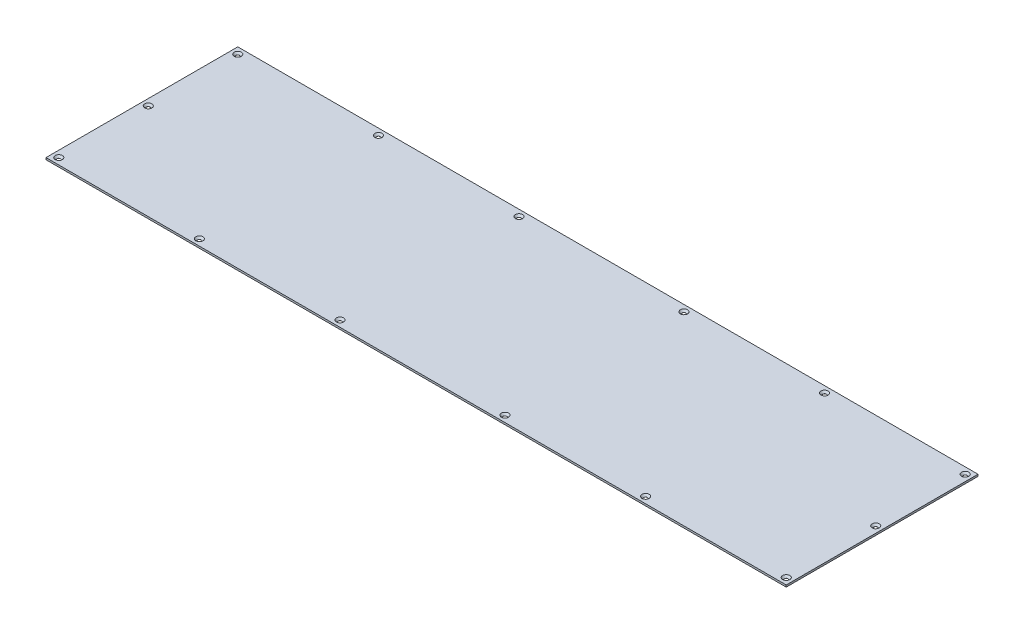
ISO-10303-21;
HEADER;
FILE_DESCRIPTION(('STEP AP214'),'2;1');
FILE_NAME('part.step','',(''),(''),'','','');
FILE_SCHEMA(('AUTOMOTIVE_DESIGN { 1 0 10303 214 1 1 1 1 }'));
ENDSEC;
DATA;
#1=APPLICATION_CONTEXT('core data for automotive mechanical design processes');
#2=APPLICATION_PROTOCOL_DEFINITION('international standard','automotive_design',2000,#1);
#3=PRODUCT_CONTEXT('',#1,'mechanical');
#4=PRODUCT('Part','Part','',(#3));
#5=PRODUCT_RELATED_PRODUCT_CATEGORY('part','',(#4));
#6=PRODUCT_DEFINITION_FORMATION('','',#4);
#7=PRODUCT_DEFINITION_CONTEXT('part definition',#1,'design');
#8=PRODUCT_DEFINITION('design','',#6,#7);
#9=PRODUCT_DEFINITION_SHAPE('','',#8);
#10=(LENGTH_UNIT() NAMED_UNIT(*) SI_UNIT(.MILLI.,.METRE.));
#11=(NAMED_UNIT(*) PLANE_ANGLE_UNIT() SI_UNIT($,.RADIAN.));
#12=(NAMED_UNIT(*) SI_UNIT($,.STERADIAN.) SOLID_ANGLE_UNIT());
#13=UNCERTAINTY_MEASURE_WITH_UNIT(LENGTH_MEASURE(1.E-05),#10,'distance_accuracy_value','');
#14=(GEOMETRIC_REPRESENTATION_CONTEXT(3) GLOBAL_UNCERTAINTY_ASSIGNED_CONTEXT((#13)) GLOBAL_UNIT_ASSIGNED_CONTEXT((#10,
#11,#12)) REPRESENTATION_CONTEXT('',''));
#15=CARTESIAN_POINT('',(0.,0.,0.));
#16=DIRECTION('',(0.,0.,1.));
#17=DIRECTION('',(1.,0.,0.));
#18=AXIS2_PLACEMENT_3D('',#15,#16,#17);
#19=CARTESIAN_POINT('',(578.999999999998,3.00000000000056,150.000000000002));
#20=DIRECTION('',(-1.,0.,0.));
#21=DIRECTION('',(0.,0.,1.00000000000001));
#22=AXIS2_PLACEMENT_3D('',#19,#20,#21);
#23=PLANE('',#22);
#24=DIRECTION('',(0.,0.,-1.00000000000001));
#25=VECTOR('',#24,1.);
#26=CARTESIAN_POINT('',(578.999999999998,5.55111512312578E-13,150.000000000002));
#27=LINE('',#26,#25);
#28=CARTESIAN_POINT('',(578.999999999998,5.55111512312578E-13,150.000000000002));
#29=VERTEX_POINT('',#28);
#30=CARTESIAN_POINT('',(579.000000000001,0.,-150.000000000002));
#31=VERTEX_POINT('',#30);
#32=EDGE_CURVE('E97',#29,#31,#27,.T.);
#33=ORIENTED_EDGE('',*,*,#32,.T.);
#34=DIRECTION('',(0.,-1.00000000000001,0.));
#35=VECTOR('',#34,1.);
#36=CARTESIAN_POINT('',(579.000000000001,3.,-150.000000000002));
#37=LINE('',#36,#35);
#38=CARTESIAN_POINT('',(579.000000000001,3.,-150.000000000002));
#39=VERTEX_POINT('',#38);
#40=EDGE_CURVE('E11',#39,#31,#37,.T.);
#41=ORIENTED_EDGE('',*,*,#40,.F.);
#42=DIRECTION('',(0.,0.,-1.00000000000001));
#43=VECTOR('',#42,1.);
#44=CARTESIAN_POINT('',(578.999999999998,3.00000000000056,150.000000000002));
#45=LINE('',#44,#43);
#46=CARTESIAN_POINT('',(578.999999999998,3.00000000000056,150.000000000002));
#47=VERTEX_POINT('',#46);
#48=EDGE_CURVE('E85',#47,#39,#45,.T.);
#49=ORIENTED_EDGE('',*,*,#48,.F.);
#50=DIRECTION('',(0.,-1.00000000000001,0.));
#51=VECTOR('',#50,1.);
#52=CARTESIAN_POINT('',(578.999999999998,3.00000000000056,150.000000000002));
#53=LINE('',#52,#51);
#54=EDGE_CURVE('E93',#47,#29,#53,.T.);
#55=ORIENTED_EDGE('',*,*,#54,.T.);
#56=EDGE_LOOP('',(#33,#41,#49,#55));
#57=FACE_BOUND('',#56,.T.);
#58=ADVANCED_FACE('F34',(#57),#23,.F.);
#59=CARTESIAN_POINT('',(-578.999999999999,3.,-150.000000000002));
#60=DIRECTION('',(0.,0.,1.00000000000001));
#61=DIRECTION('',(1.,0.,0.));
#62=AXIS2_PLACEMENT_3D('',#59,#60,#61);
#63=PLANE('',#62);
#64=DIRECTION('',(-1.,0.,0.));
#65=VECTOR('',#64,1.);
#66=CARTESIAN_POINT('',(-578.999999999999,0.,-150.000000000002));
#67=LINE('',#66,#65);
#68=CARTESIAN_POINT('',(-578.999999999999,0.,-150.000000000002));
#69=VERTEX_POINT('',#68);
#70=EDGE_CURVE('E89',#31,#69,#67,.T.);
#71=ORIENTED_EDGE('',*,*,#70,.T.);
#72=DIRECTION('',(0.,-1.00000000000001,0.));
#73=VECTOR('',#72,1.);
#74=CARTESIAN_POINT('',(-578.999999999999,3.,-150.000000000002));
#75=LINE('',#74,#73);
#76=CARTESIAN_POINT('',(-578.999999999999,3.,-150.000000000002));
#77=VERTEX_POINT('',#76);
#78=EDGE_CURVE('E42',#77,#69,#75,.T.);
#79=ORIENTED_EDGE('',*,*,#78,.F.);
#80=DIRECTION('',(-1.,0.,0.));
#81=VECTOR('',#80,1.);
#82=CARTESIAN_POINT('',(-578.999999999999,3.,-150.000000000002));
#83=LINE('',#82,#81);
#84=EDGE_CURVE('E80',#39,#77,#83,.T.);
#85=ORIENTED_EDGE('',*,*,#84,.F.);
#86=ORIENTED_EDGE('',*,*,#40,.T.);
#87=EDGE_LOOP('',(#71,#79,#85,#86));
#88=FACE_BOUND('',#87,.T.);
#89=ADVANCED_FACE('F88',(#88),#63,.F.);
#90=CARTESIAN_POINT('',(-579.000000000002,3.00000000000056,150.000000000001));
#91=DIRECTION('',(1.,0.,0.));
#92=DIRECTION('',(0.,0.,-1.00000000000001));
#93=AXIS2_PLACEMENT_3D('',#90,#91,#92);
#94=PLANE('',#93);
#95=DIRECTION('',(0.,0.,1.00000000000001));
#96=VECTOR('',#95,1.);
#97=CARTESIAN_POINT('',(-579.000000000002,5.55111512312578E-13,150.000000000001));
#98=LINE('',#97,#96);
#99=CARTESIAN_POINT('',(-579.000000000002,5.55111512312578E-13,150.000000000001));
#100=VERTEX_POINT('',#99);
#101=EDGE_CURVE('E67',#69,#100,#98,.T.);
#102=ORIENTED_EDGE('',*,*,#101,.T.);
#103=DIRECTION('',(0.,-1.00000000000001,0.));
#104=VECTOR('',#103,1.);
#105=CARTESIAN_POINT('',(-579.000000000002,3.00000000000056,150.000000000001));
#106=LINE('',#105,#104);
#107=CARTESIAN_POINT('',(-579.000000000002,3.00000000000056,150.000000000001));
#108=VERTEX_POINT('',#107);
#109=EDGE_CURVE('E90',#108,#100,#106,.T.);
#110=ORIENTED_EDGE('',*,*,#109,.F.);
#111=DIRECTION('',(0.,0.,1.00000000000001));
#112=VECTOR('',#111,1.);
#113=CARTESIAN_POINT('',(-579.000000000002,3.00000000000056,150.000000000001));
#114=LINE('',#113,#112);
#115=EDGE_CURVE('E83',#77,#108,#114,.T.);
#116=ORIENTED_EDGE('',*,*,#115,.F.);
#117=ORIENTED_EDGE('',*,*,#78,.T.);
#118=EDGE_LOOP('',(#102,#110,#116,#117));
#119=FACE_BOUND('',#118,.T.);
#120=ADVANCED_FACE('F91',(#119),#94,.F.);
#121=CARTESIAN_POINT('',(-579.000000000002,3.00000000000056,150.000000000001));
#122=DIRECTION('',(0.,0.,-1.00000000000001));
#123=DIRECTION('',(-1.,0.,0.));
#124=AXIS2_PLACEMENT_3D('',#121,#122,#123);
#125=PLANE('',#124);
#126=DIRECTION('',(1.,0.,0.));
#127=VECTOR('',#126,1.);
#128=CARTESIAN_POINT('',(-579.000000000002,5.55111512312578E-13,150.000000000001));
#129=LINE('',#128,#127);
#130=EDGE_CURVE('E73',#100,#29,#129,.T.);
#131=ORIENTED_EDGE('',*,*,#130,.T.);
#132=ORIENTED_EDGE('',*,*,#54,.F.);
#133=DIRECTION('',(1.,0.,0.));
#134=VECTOR('',#133,1.);
#135=CARTESIAN_POINT('',(-579.000000000002,3.00000000000056,150.000000000001));
#136=LINE('',#135,#134);
#137=EDGE_CURVE('E50',#108,#47,#136,.T.);
#138=ORIENTED_EDGE('',*,*,#137,.F.);
#139=ORIENTED_EDGE('',*,*,#109,.T.);
#140=EDGE_LOOP('',(#131,#132,#138,#139));
#141=FACE_BOUND('',#140,.T.);
#142=ADVANCED_FACE('F105',(#141),#125,.F.);
#143=CARTESIAN_POINT('',(0.,3.,1.11022302462516E-13));
#144=DIRECTION('',(0.,-1.00000000000001,0.));
#145=DIRECTION('',(0.,0.,-1.00000000000001));
#146=AXIS2_PLACEMENT_3D('',#143,#144,#145);
#147=PLANE('',#146);
#148=CARTESIAN_POINT('',(-569.,2.99999999999984,140.000000000002));
#149=DIRECTION('',(0.,1.00000000000001,0.));
#150=DIRECTION('',(0.,0.,1.00000000000001));
#151=AXIS2_PLACEMENT_3D('',#148,#149,#150);
#152=CIRCLE('',#151,5.60000000000005);
#153=CARTESIAN_POINT('',(-569.,2.99999999999984,145.600000000002));
#154=VERTEX_POINT('',#153);
#155=EDGE_CURVE('E233',#154,#154,#152,.T.);
#156=ORIENTED_EDGE('',*,*,#155,.F.);
#157=EDGE_LOOP('',(#156));
#158=FACE_BOUND('',#157,.T.);
#159=CARTESIAN_POINT('',(-568.999999999999,3.,1.11022302462516E-13));
#160=DIRECTION('',(0.,1.00000000000001,0.));
#161=DIRECTION('',(0.,0.,1.00000000000001));
#162=AXIS2_PLACEMENT_3D('',#159,#160,#161);
#163=CIRCLE('',#162,5.60000000000005);
#164=CARTESIAN_POINT('',(-568.999999999999,3.,5.60000000000024));
#165=VERTEX_POINT('',#164);
#166=EDGE_CURVE('E224',#165,#165,#163,.T.);
#167=ORIENTED_EDGE('',*,*,#166,.F.);
#168=EDGE_LOOP('',(#167));
#169=FACE_BOUND('',#168,.T.);
#170=CARTESIAN_POINT('',(-569.000000000001,3.00000000000003,-140.000000000002));
#171=DIRECTION('',(0.,1.00000000000001,0.));
#172=DIRECTION('',(0.,0.,1.00000000000001));
#173=AXIS2_PLACEMENT_3D('',#170,#171,#172);
#174=CIRCLE('',#173,5.60000000000005);
#175=CARTESIAN_POINT('',(-569.000000000001,3.00000000000003,-134.400000000002));
#176=VERTEX_POINT('',#175);
#177=EDGE_CURVE('E215',#176,#176,#174,.T.);
#178=ORIENTED_EDGE('',*,*,#177,.F.);
#179=EDGE_LOOP('',(#178));
#180=FACE_BOUND('',#179,.T.);
#181=CARTESIAN_POINT('',(-348.999999999999,3.00000000000089,-140.000000000002));
#182=DIRECTION('',(0.,1.00000000000001,0.));
#183=DIRECTION('',(0.,0.,1.00000000000001));
#184=AXIS2_PLACEMENT_3D('',#181,#182,#183);
#185=CIRCLE('',#184,5.59999999999999);
#186=CARTESIAN_POINT('',(-348.999999999999,3.00000000000089,-134.400000000002));
#187=VERTEX_POINT('',#186);
#188=EDGE_CURVE('E206',#187,#187,#185,.T.);
#189=ORIENTED_EDGE('',*,*,#188,.F.);
#190=EDGE_LOOP('',(#189));
#191=FACE_BOUND('',#190,.T.);
#192=CARTESIAN_POINT('',(-349.000000000001,3.00000000000056,140.000000000001));
#193=DIRECTION('',(0.,1.00000000000001,0.));
#194=DIRECTION('',(0.,0.,1.00000000000001));
#195=AXIS2_PLACEMENT_3D('',#192,#193,#194);
#196=CIRCLE('',#195,5.59999999999999);
#197=CARTESIAN_POINT('',(-349.000000000001,3.00000000000056,145.600000000001));
#198=VERTEX_POINT('',#197);
#199=EDGE_CURVE('E197',#198,#198,#196,.T.);
#200=ORIENTED_EDGE('',*,*,#199,.F.);
#201=EDGE_LOOP('',(#200));
#202=FACE_BOUND('',#201,.T.);
#203=CARTESIAN_POINT('',(-129.,3.00000000000056,140.000000000002));
#204=DIRECTION('',(0.,1.00000000000001,0.));
#205=DIRECTION('',(0.,0.,1.00000000000001));
#206=AXIS2_PLACEMENT_3D('',#203,#204,#205);
#207=CIRCLE('',#206,5.59999999999999);
#208=CARTESIAN_POINT('',(-129.,3.00000000000056,145.600000000002));
#209=VERTEX_POINT('',#208);
#210=EDGE_CURVE('E188',#209,#209,#207,.T.);
#211=ORIENTED_EDGE('',*,*,#210,.F.);
#212=EDGE_LOOP('',(#211));
#213=FACE_BOUND('',#212,.T.);
#214=CARTESIAN_POINT('',(-129.,3.00000000000067,-140.000000000002));
#215=DIRECTION('',(0.,1.00000000000001,0.));
#216=DIRECTION('',(0.,0.,1.00000000000001));
#217=AXIS2_PLACEMENT_3D('',#214,#215,#216);
#218=CIRCLE('',#217,5.59999999999999);
#219=CARTESIAN_POINT('',(-129.,3.00000000000067,-134.400000000002));
#220=VERTEX_POINT('',#219);
#221=EDGE_CURVE('E179',#220,#220,#218,.T.);
#222=ORIENTED_EDGE('',*,*,#221,.F.);
#223=EDGE_LOOP('',(#222));
#224=FACE_BOUND('',#223,.T.);
#225=CARTESIAN_POINT('',(129.,3.,-140.000000000002));
#226=DIRECTION('',(0.,1.00000000000001,0.));
#227=DIRECTION('',(0.,0.,1.00000000000001));
#228=AXIS2_PLACEMENT_3D('',#225,#226,#227);
#229=CIRCLE('',#228,5.59999999999999);
#230=CARTESIAN_POINT('',(129.,3.,-134.400000000002));
#231=VERTEX_POINT('',#230);
#232=EDGE_CURVE('E170',#231,#231,#229,.T.);
#233=ORIENTED_EDGE('',*,*,#232,.F.);
#234=EDGE_LOOP('',(#233));
#235=FACE_BOUND('',#234,.T.);
#236=CARTESIAN_POINT('',(129.000000000001,2.99999999999989,140.000000000001));
#237=DIRECTION('',(0.,1.00000000000001,0.));
#238=DIRECTION('',(0.,0.,1.00000000000001));
#239=AXIS2_PLACEMENT_3D('',#236,#237,#238);
#240=CIRCLE('',#239,5.59999999999999);
#241=CARTESIAN_POINT('',(129.000000000001,2.99999999999989,145.600000000001));
#242=VERTEX_POINT('',#241);
#243=EDGE_CURVE('E161',#242,#242,#240,.T.);
#244=ORIENTED_EDGE('',*,*,#243,.F.);
#245=EDGE_LOOP('',(#244));
#246=FACE_BOUND('',#245,.T.);
#247=CARTESIAN_POINT('',(348.999999999999,2.99999999999967,140.000000000002));
#248=DIRECTION('',(0.,1.00000000000001,0.));
#249=DIRECTION('',(0.,0.,1.00000000000001));
#250=AXIS2_PLACEMENT_3D('',#247,#248,#249);
#251=CIRCLE('',#250,5.59999999999999);
#252=CARTESIAN_POINT('',(348.999999999999,2.99999999999967,145.600000000002));
#253=VERTEX_POINT('',#252);
#254=EDGE_CURVE('E152',#253,#253,#251,.T.);
#255=ORIENTED_EDGE('',*,*,#254,.F.);
#256=EDGE_LOOP('',(#255));
#257=FACE_BOUND('',#256,.T.);
#258=CARTESIAN_POINT('',(349.000000000001,3.,-140.000000000002));
#259=DIRECTION('',(0.,1.00000000000001,0.));
#260=DIRECTION('',(0.,0.,1.00000000000001));
#261=AXIS2_PLACEMENT_3D('',#258,#259,#260);
#262=CIRCLE('',#261,5.59999999999999);
#263=CARTESIAN_POINT('',(349.000000000001,3.,-134.400000000002));
#264=VERTEX_POINT('',#263);
#265=EDGE_CURVE('E143',#264,#264,#262,.T.);
#266=ORIENTED_EDGE('',*,*,#265,.F.);
#267=EDGE_LOOP('',(#266));
#268=FACE_BOUND('',#267,.T.);
#269=CARTESIAN_POINT('',(568.999999999999,3.00000000000089,-140.000000000002));
#270=DIRECTION('',(0.,1.00000000000001,0.));
#271=DIRECTION('',(0.,0.,1.00000000000001));
#272=AXIS2_PLACEMENT_3D('',#269,#270,#271);
#273=CIRCLE('',#272,5.60000000000005);
#274=CARTESIAN_POINT('',(568.999999999999,3.00000000000089,-134.400000000002));
#275=VERTEX_POINT('',#274);
#276=EDGE_CURVE('E134',#275,#275,#273,.T.);
#277=ORIENTED_EDGE('',*,*,#276,.F.);
#278=EDGE_LOOP('',(#277));
#279=FACE_BOUND('',#278,.T.);
#280=CARTESIAN_POINT('',(569.,3.00000000000056,140.000000000002));
#281=DIRECTION('',(0.,1.00000000000001,0.));
#282=DIRECTION('',(0.,0.,1.00000000000001));
#283=AXIS2_PLACEMENT_3D('',#280,#281,#282);
#284=CIRCLE('',#283,5.60000000000005);
#285=CARTESIAN_POINT('',(569.,3.00000000000056,145.600000000002));
#286=VERTEX_POINT('',#285);
#287=EDGE_CURVE('E125',#286,#286,#284,.T.);
#288=ORIENTED_EDGE('',*,*,#287,.F.);
#289=EDGE_LOOP('',(#288));
#290=FACE_BOUND('',#289,.T.);
#291=CARTESIAN_POINT('',(569.000000000002,3.,1.66533453693773E-13));
#292=DIRECTION('',(0.,1.00000000000001,0.));
#293=DIRECTION('',(0.,0.,1.00000000000001));
#294=AXIS2_PLACEMENT_3D('',#291,#292,#293);
#295=CIRCLE('',#294,5.60000000000005);
#296=CARTESIAN_POINT('',(569.000000000002,3.,5.6000000000003));
#297=VERTEX_POINT('',#296);
#298=EDGE_CURVE('E116',#297,#297,#295,.T.);
#299=ORIENTED_EDGE('',*,*,#298,.F.);
#300=EDGE_LOOP('',(#299));
#301=FACE_BOUND('',#300,.T.);
#302=ORIENTED_EDGE('',*,*,#48,.T.);
#303=ORIENTED_EDGE('',*,*,#84,.T.);
#304=ORIENTED_EDGE('',*,*,#115,.T.);
#305=ORIENTED_EDGE('',*,*,#137,.T.);
#306=EDGE_LOOP('',(#302,#303,#304,#305));
#307=FACE_BOUND('',#306,.T.);
#308=ADVANCED_FACE('F81',(#158,#169,#180,#191,#202,#213,#224,#235,#246,#257,#268,#279,#290,#301,
#307),#147,.F.);
#309=CARTESIAN_POINT('',(0.,0.,0.));
#310=DIRECTION('',(0.,-1.00000000000001,0.));
#311=DIRECTION('',(0.,0.,-1.00000000000001));
#312=AXIS2_PLACEMENT_3D('',#309,#310,#311);
#313=PLANE('',#312);
#314=CARTESIAN_POINT('',(-569.,-3.33066907387547E-13,140.000000000001));
#315=DIRECTION('',(0.,1.00000000000001,0.));
#316=DIRECTION('',(0.,0.,1.00000000000001));
#317=AXIS2_PLACEMENT_3D('',#314,#315,#316);
#318=CIRCLE('',#317,2.75000000000003);
#319=CARTESIAN_POINT('',(-569.,-3.33066907387547E-13,142.750000000001));
#320=VERTEX_POINT('',#319);
#321=EDGE_CURVE('E227',#320,#320,#318,.T.);
#322=ORIENTED_EDGE('',*,*,#321,.T.);
#323=EDGE_LOOP('',(#322));
#324=FACE_BOUND('',#323,.T.);
#325=CARTESIAN_POINT('',(-568.999999999999,0.,0.));
#326=DIRECTION('',(0.,1.00000000000001,0.));
#327=DIRECTION('',(0.,0.,1.00000000000001));
#328=AXIS2_PLACEMENT_3D('',#325,#326,#327);
#329=CIRCLE('',#328,2.75000000000003);
#330=CARTESIAN_POINT('',(-568.999999999999,0.,2.75000000000007));
#331=VERTEX_POINT('',#330);
#332=EDGE_CURVE('E218',#331,#331,#329,.T.);
#333=ORIENTED_EDGE('',*,*,#332,.T.);
#334=EDGE_LOOP('',(#333));
#335=FACE_BOUND('',#334,.T.);
#336=CARTESIAN_POINT('',(-569.000000000001,0.,-140.000000000002));
#337=DIRECTION('',(0.,1.00000000000001,0.));
#338=DIRECTION('',(0.,0.,1.00000000000001));
#339=AXIS2_PLACEMENT_3D('',#336,#337,#338);
#340=CIRCLE('',#339,2.75000000000003);
#341=CARTESIAN_POINT('',(-569.000000000001,0.,-137.250000000002));
#342=VERTEX_POINT('',#341);
#343=EDGE_CURVE('E209',#342,#342,#340,.T.);
#344=ORIENTED_EDGE('',*,*,#343,.T.);
#345=EDGE_LOOP('',(#344));
#346=FACE_BOUND('',#345,.T.);
#347=CARTESIAN_POINT('',(-349.,8.88178419700125E-13,-140.000000000002));
#348=DIRECTION('',(0.,1.00000000000001,0.));
#349=DIRECTION('',(0.,0.,1.00000000000001));
#350=AXIS2_PLACEMENT_3D('',#347,#348,#349);
#351=CIRCLE('',#350,2.74999999999997);
#352=CARTESIAN_POINT('',(-349.,8.88178419700125E-13,-137.250000000002));
#353=VERTEX_POINT('',#352);
#354=EDGE_CURVE('E200',#353,#353,#351,.T.);
#355=ORIENTED_EDGE('',*,*,#354,.T.);
#356=EDGE_LOOP('',(#355));
#357=FACE_BOUND('',#356,.T.);
#358=CARTESIAN_POINT('',(-349.000000000001,5.55111512312578E-13,140.000000000001));
#359=DIRECTION('',(0.,1.00000000000001,0.));
#360=DIRECTION('',(0.,0.,1.00000000000001));
#361=AXIS2_PLACEMENT_3D('',#358,#359,#360);
#362=CIRCLE('',#361,2.74999999999997);
#363=CARTESIAN_POINT('',(-349.000000000001,5.55111512312578E-13,142.750000000001));
#364=VERTEX_POINT('',#363);
#365=EDGE_CURVE('E191',#364,#364,#362,.T.);
#366=ORIENTED_EDGE('',*,*,#365,.T.);
#367=EDGE_LOOP('',(#366));
#368=FACE_BOUND('',#367,.T.);
#369=CARTESIAN_POINT('',(-129.,5.55111512312578E-13,140.000000000002));
#370=DIRECTION('',(0.,1.00000000000001,0.));
#371=DIRECTION('',(0.,0.,1.00000000000001));
#372=AXIS2_PLACEMENT_3D('',#369,#370,#371);
#373=CIRCLE('',#372,2.75);
#374=CARTESIAN_POINT('',(-129.,5.55111512312578E-13,142.750000000002));
#375=VERTEX_POINT('',#374);
#376=EDGE_CURVE('E182',#375,#375,#373,.T.);
#377=ORIENTED_EDGE('',*,*,#376,.T.);
#378=EDGE_LOOP('',(#377));
#379=FACE_BOUND('',#378,.T.);
#380=CARTESIAN_POINT('',(-129.,6.66133814775094E-13,-140.000000000002));
#381=DIRECTION('',(0.,1.00000000000001,0.));
#382=DIRECTION('',(0.,0.,1.00000000000001));
#383=AXIS2_PLACEMENT_3D('',#380,#381,#382);
#384=CIRCLE('',#383,2.75);
#385=CARTESIAN_POINT('',(-129.,6.66133814775094E-13,-137.250000000002));
#386=VERTEX_POINT('',#385);
#387=EDGE_CURVE('E173',#386,#386,#384,.T.);
#388=ORIENTED_EDGE('',*,*,#387,.T.);
#389=EDGE_LOOP('',(#388));
#390=FACE_BOUND('',#389,.T.);
#391=CARTESIAN_POINT('',(129.,0.,-140.000000000002));
#392=DIRECTION('',(0.,1.00000000000001,0.));
#393=DIRECTION('',(0.,0.,1.00000000000001));
#394=AXIS2_PLACEMENT_3D('',#391,#392,#393);
#395=CIRCLE('',#394,2.75);
#396=CARTESIAN_POINT('',(129.,0.,-137.250000000002));
#397=VERTEX_POINT('',#396);
#398=EDGE_CURVE('E164',#397,#397,#395,.T.);
#399=ORIENTED_EDGE('',*,*,#398,.T.);
#400=EDGE_LOOP('',(#399));
#401=FACE_BOUND('',#400,.T.);
#402=CARTESIAN_POINT('',(129.000000000001,-1.11022302462516E-13,140.000000000001));
#403=DIRECTION('',(0.,1.00000000000001,0.));
#404=DIRECTION('',(0.,0.,1.00000000000001));
#405=AXIS2_PLACEMENT_3D('',#402,#403,#404);
#406=CIRCLE('',#405,2.75);
#407=CARTESIAN_POINT('',(129.000000000001,-1.11022302462516E-13,142.750000000001));
#408=VERTEX_POINT('',#407);
#409=EDGE_CURVE('E155',#408,#408,#406,.T.);
#410=ORIENTED_EDGE('',*,*,#409,.T.);
#411=EDGE_LOOP('',(#410));
#412=FACE_BOUND('',#411,.T.);
#413=CARTESIAN_POINT('',(348.999999999999,-3.33066907387547E-13,140.000000000002));
#414=DIRECTION('',(0.,1.00000000000001,0.));
#415=DIRECTION('',(0.,0.,1.00000000000001));
#416=AXIS2_PLACEMENT_3D('',#413,#414,#415);
#417=CIRCLE('',#416,2.74999999999997);
#418=CARTESIAN_POINT('',(348.999999999999,-3.33066907387547E-13,142.750000000002));
#419=VERTEX_POINT('',#418);
#420=EDGE_CURVE('E146',#419,#419,#417,.T.);
#421=ORIENTED_EDGE('',*,*,#420,.T.);
#422=EDGE_LOOP('',(#421));
#423=FACE_BOUND('',#422,.T.);
#424=CARTESIAN_POINT('',(349.,0.,-140.000000000002));
#425=DIRECTION('',(0.,1.00000000000001,0.));
#426=DIRECTION('',(0.,0.,1.00000000000001));
#427=AXIS2_PLACEMENT_3D('',#424,#425,#426);
#428=CIRCLE('',#427,2.74999999999997);
#429=CARTESIAN_POINT('',(349.,0.,-137.250000000002));
#430=VERTEX_POINT('',#429);
#431=EDGE_CURVE('E137',#430,#430,#428,.T.);
#432=ORIENTED_EDGE('',*,*,#431,.T.);
#433=EDGE_LOOP('',(#432));
#434=FACE_BOUND('',#433,.T.);
#435=CARTESIAN_POINT('',(568.999999999999,8.88178419700125E-13,-140.000000000001));
#436=DIRECTION('',(0.,1.00000000000001,0.));
#437=DIRECTION('',(0.,0.,1.00000000000001));
#438=AXIS2_PLACEMENT_3D('',#435,#436,#437);
#439=CIRCLE('',#438,2.75000000000003);
#440=CARTESIAN_POINT('',(568.999999999999,8.88178419700125E-13,-137.250000000001));
#441=VERTEX_POINT('',#440);
#442=EDGE_CURVE('E128',#441,#441,#439,.T.);
#443=ORIENTED_EDGE('',*,*,#442,.T.);
#444=EDGE_LOOP('',(#443));
#445=FACE_BOUND('',#444,.T.);
#446=CARTESIAN_POINT('',(569.,5.27355936696949E-13,140.000000000002));
#447=DIRECTION('',(0.,1.00000000000001,0.));
#448=DIRECTION('',(0.,0.,1.00000000000001));
#449=AXIS2_PLACEMENT_3D('',#446,#447,#448);
#450=CIRCLE('',#449,2.75000000000003);
#451=CARTESIAN_POINT('',(569.,5.27355936696949E-13,142.750000000002));
#452=VERTEX_POINT('',#451);
#453=EDGE_CURVE('E119',#452,#452,#450,.T.);
#454=ORIENTED_EDGE('',*,*,#453,.T.);
#455=EDGE_LOOP('',(#454));
#456=FACE_BOUND('',#455,.T.);
#457=CARTESIAN_POINT('',(569.000000000002,0.,1.66533453693773E-13));
#458=DIRECTION('',(0.,1.00000000000001,0.));
#459=DIRECTION('',(0.,0.,1.00000000000001));
#460=AXIS2_PLACEMENT_3D('',#457,#458,#459);
#461=CIRCLE('',#460,2.75000000000003);
#462=CARTESIAN_POINT('',(569.000000000002,0.,2.75000000000024));
#463=VERTEX_POINT('',#462);
#464=EDGE_CURVE('E100',#463,#463,#461,.T.);
#465=ORIENTED_EDGE('',*,*,#464,.T.);
#466=EDGE_LOOP('',(#465));
#467=FACE_BOUND('',#466,.T.);
#468=ORIENTED_EDGE('',*,*,#32,.F.);
#469=ORIENTED_EDGE('',*,*,#130,.F.);
#470=ORIENTED_EDGE('',*,*,#101,.F.);
#471=ORIENTED_EDGE('',*,*,#70,.F.);
#472=EDGE_LOOP('',(#468,#469,#470,#471));
#473=FACE_BOUND('',#472,.T.);
#474=ADVANCED_FACE('F108',(#324,#335,#346,#357,#368,#379,#390,#401,#412,#423,#434,#445,#456,
#467,#473),#313,.T.);
#475=CARTESIAN_POINT('',(569.000000000002,3.,1.66533453693773E-13));
#476=DIRECTION('',(0.,1.00000000000001,0.));
#477=DIRECTION('',(0.,0.,1.00000000000001));
#478=AXIS2_PLACEMENT_3D('',#475,#476,#477);
#479=CYLINDRICAL_SURFACE('',#478,2.75000000000003);
#480=ORIENTED_EDGE('',*,*,#464,.F.);
#481=EDGE_LOOP('',(#480));
#482=FACE_BOUND('',#481,.T.);
#483=CARTESIAN_POINT('',(569.000000000002,0.150000000000039,1.66533453693773E-13));
#484=DIRECTION('',(0.,1.00000000000001,0.));
#485=DIRECTION('',(0.,0.,1.00000000000001));
#486=AXIS2_PLACEMENT_3D('',#483,#484,#485);
#487=CIRCLE('',#486,2.75000000000003);
#488=CARTESIAN_POINT('',(569.000000000002,0.150000000000039,2.75000000000024));
#489=VERTEX_POINT('',#488);
#490=EDGE_CURVE('E113',#489,#489,#487,.T.);
#491=ORIENTED_EDGE('',*,*,#490,.T.);
#492=EDGE_LOOP('',(#491));
#493=FACE_BOUND('',#492,.T.);
#494=ADVANCED_FACE('F271',(#482,#493),#479,.F.);
#495=CARTESIAN_POINT('',(569.000000000002,3.,1.66533453693773E-13));
#496=DIRECTION('',(0.,1.00000000000001,0.));
#497=DIRECTION('',(0.,0.,1.00000000000001));
#498=AXIS2_PLACEMENT_3D('',#495,#496,#497);
#499=CONICAL_SURFACE('',#498,5.60000000000005,0.785398163397454);
#500=ORIENTED_EDGE('',*,*,#490,.F.);
#501=EDGE_LOOP('',(#500));
#502=FACE_BOUND('',#501,.T.);
#503=ORIENTED_EDGE('',*,*,#298,.T.);
#504=EDGE_LOOP('',(#503));
#505=FACE_BOUND('',#504,.T.);
#506=ADVANCED_FACE('F268',(#502,#505),#499,.F.);
#507=CARTESIAN_POINT('',(569.,3.00000000000056,140.000000000002));
#508=DIRECTION('',(0.,1.00000000000001,0.));
#509=DIRECTION('',(0.,0.,1.00000000000001));
#510=AXIS2_PLACEMENT_3D('',#507,#508,#509);
#511=CYLINDRICAL_SURFACE('',#510,2.75000000000003);
#512=ORIENTED_EDGE('',*,*,#453,.F.);
#513=EDGE_LOOP('',(#512));
#514=FACE_BOUND('',#513,.T.);
#515=CARTESIAN_POINT('',(569.,0.150000000000566,140.000000000002));
#516=DIRECTION('',(0.,1.00000000000001,0.));
#517=DIRECTION('',(0.,0.,1.00000000000001));
#518=AXIS2_PLACEMENT_3D('',#515,#516,#517);
#519=CIRCLE('',#518,2.75000000000003);
#520=CARTESIAN_POINT('',(569.,0.150000000000566,142.750000000002));
#521=VERTEX_POINT('',#520);
#522=EDGE_CURVE('E122',#521,#521,#519,.T.);
#523=ORIENTED_EDGE('',*,*,#522,.T.);
#524=EDGE_LOOP('',(#523));
#525=FACE_BOUND('',#524,.T.);
#526=ADVANCED_FACE('F270',(#514,#525),#511,.F.);
#527=CARTESIAN_POINT('',(569.,3.00000000000056,140.000000000002));
#528=DIRECTION('',(0.,1.00000000000001,0.));
#529=DIRECTION('',(0.,0.,1.00000000000001));
#530=AXIS2_PLACEMENT_3D('',#527,#528,#529);
#531=CONICAL_SURFACE('',#530,5.60000000000005,0.785398163397454);
#532=ORIENTED_EDGE('',*,*,#522,.F.);
#533=EDGE_LOOP('',(#532));
#534=FACE_BOUND('',#533,.T.);
#535=ORIENTED_EDGE('',*,*,#287,.T.);
#536=EDGE_LOOP('',(#535));
#537=FACE_BOUND('',#536,.T.);
#538=ADVANCED_FACE('F278',(#534,#537),#531,.F.);
#539=CARTESIAN_POINT('',(568.999999999999,3.00000000000089,-140.000000000002));
#540=DIRECTION('',(0.,1.00000000000001,0.));
#541=DIRECTION('',(0.,0.,1.00000000000001));
#542=AXIS2_PLACEMENT_3D('',#539,#540,#541);
#543=CYLINDRICAL_SURFACE('',#542,2.75000000000003);
#544=ORIENTED_EDGE('',*,*,#442,.F.);
#545=EDGE_LOOP('',(#544));
#546=FACE_BOUND('',#545,.T.);
#547=CARTESIAN_POINT('',(568.999999999999,0.150000000000927,-140.000000000002));
#548=DIRECTION('',(0.,1.00000000000001,0.));
#549=DIRECTION('',(0.,0.,1.00000000000001));
#550=AXIS2_PLACEMENT_3D('',#547,#548,#549);
#551=CIRCLE('',#550,2.75000000000003);
#552=CARTESIAN_POINT('',(568.999999999999,0.150000000000927,-137.250000000002));
#553=VERTEX_POINT('',#552);
#554=EDGE_CURVE('E131',#553,#553,#551,.T.);
#555=ORIENTED_EDGE('',*,*,#554,.T.);
#556=EDGE_LOOP('',(#555));
#557=FACE_BOUND('',#556,.T.);
#558=ADVANCED_FACE('F332',(#546,#557),#543,.F.);
#559=CARTESIAN_POINT('',(568.999999999999,3.00000000000089,-140.000000000002));
#560=DIRECTION('',(0.,1.00000000000001,0.));
#561=DIRECTION('',(0.,0.,1.00000000000001));
#562=AXIS2_PLACEMENT_3D('',#559,#560,#561);
#563=CONICAL_SURFACE('',#562,5.60000000000005,0.785398163397454);
#564=ORIENTED_EDGE('',*,*,#554,.F.);
#565=EDGE_LOOP('',(#564));
#566=FACE_BOUND('',#565,.T.);
#567=ORIENTED_EDGE('',*,*,#276,.T.);
#568=EDGE_LOOP('',(#567));
#569=FACE_BOUND('',#568,.T.);
#570=ADVANCED_FACE('F337',(#566,#569),#563,.F.);
#571=CARTESIAN_POINT('',(349.000000000001,3.,-140.000000000002));
#572=DIRECTION('',(0.,1.00000000000001,0.));
#573=DIRECTION('',(0.,0.,1.00000000000001));
#574=AXIS2_PLACEMENT_3D('',#571,#572,#573);
#575=CYLINDRICAL_SURFACE('',#574,2.74999999999997);
#576=ORIENTED_EDGE('',*,*,#431,.F.);
#577=EDGE_LOOP('',(#576));
#578=FACE_BOUND('',#577,.T.);
#579=CARTESIAN_POINT('',(349.,0.150000000000039,-140.000000000002));
#580=DIRECTION('',(0.,1.00000000000001,0.));
#581=DIRECTION('',(0.,0.,1.00000000000001));
#582=AXIS2_PLACEMENT_3D('',#579,#580,#581);
#583=CIRCLE('',#582,2.74999999999997);
#584=CARTESIAN_POINT('',(349.,0.150000000000039,-137.250000000002));
#585=VERTEX_POINT('',#584);
#586=EDGE_CURVE('E140',#585,#585,#583,.T.);
#587=ORIENTED_EDGE('',*,*,#586,.T.);
#588=EDGE_LOOP('',(#587));
#589=FACE_BOUND('',#588,.T.);
#590=ADVANCED_FACE('F343',(#578,#589),#575,.F.);
#591=CARTESIAN_POINT('',(349.000000000001,3.,-140.000000000002));
#592=DIRECTION('',(0.,1.00000000000001,0.));
#593=DIRECTION('',(0.,0.,1.00000000000001));
#594=AXIS2_PLACEMENT_3D('',#591,#592,#593);
#595=CONICAL_SURFACE('',#594,5.59999999999999,0.785398163397454);
#596=ORIENTED_EDGE('',*,*,#586,.F.);
#597=EDGE_LOOP('',(#596));
#598=FACE_BOUND('',#597,.T.);
#599=ORIENTED_EDGE('',*,*,#265,.T.);
#600=EDGE_LOOP('',(#599));
#601=FACE_BOUND('',#600,.T.);
#602=ADVANCED_FACE('F347',(#598,#601),#595,.F.);
#603=CARTESIAN_POINT('',(348.999999999999,2.99999999999967,140.000000000002));
#604=DIRECTION('',(0.,1.00000000000001,0.));
#605=DIRECTION('',(0.,0.,1.00000000000001));
#606=AXIS2_PLACEMENT_3D('',#603,#604,#605);
#607=CYLINDRICAL_SURFACE('',#606,2.74999999999997);
#608=ORIENTED_EDGE('',*,*,#420,.F.);
#609=EDGE_LOOP('',(#608));
#610=FACE_BOUND('',#609,.T.);
#611=CARTESIAN_POINT('',(348.999999999999,0.149999999999706,140.000000000002));
#612=DIRECTION('',(0.,1.00000000000001,0.));
#613=DIRECTION('',(0.,0.,1.00000000000001));
#614=AXIS2_PLACEMENT_3D('',#611,#612,#613);
#615=CIRCLE('',#614,2.74999999999997);
#616=CARTESIAN_POINT('',(348.999999999999,0.149999999999706,142.750000000002));
#617=VERTEX_POINT('',#616);
#618=EDGE_CURVE('E149',#617,#617,#615,.T.);
#619=ORIENTED_EDGE('',*,*,#618,.T.);
#620=EDGE_LOOP('',(#619));
#621=FACE_BOUND('',#620,.T.);
#622=ADVANCED_FACE('F351',(#610,#621),#607,.F.);
#623=CARTESIAN_POINT('',(348.999999999999,2.99999999999967,140.000000000002));
#624=DIRECTION('',(0.,1.00000000000001,0.));
#625=DIRECTION('',(0.,0.,1.00000000000001));
#626=AXIS2_PLACEMENT_3D('',#623,#624,#625);
#627=CONICAL_SURFACE('',#626,5.59999999999999,0.785398163397454);
#628=ORIENTED_EDGE('',*,*,#618,.F.);
#629=EDGE_LOOP('',(#628));
#630=FACE_BOUND('',#629,.T.);
#631=ORIENTED_EDGE('',*,*,#254,.T.);
#632=EDGE_LOOP('',(#631));
#633=FACE_BOUND('',#632,.T.);
#634=ADVANCED_FACE('F355',(#630,#633),#627,.F.);
#635=CARTESIAN_POINT('',(129.000000000001,2.99999999999989,140.000000000001));
#636=DIRECTION('',(0.,1.00000000000001,0.));
#637=DIRECTION('',(0.,0.,1.00000000000001));
#638=AXIS2_PLACEMENT_3D('',#635,#636,#637);
#639=CYLINDRICAL_SURFACE('',#638,2.75);
#640=ORIENTED_EDGE('',*,*,#409,.F.);
#641=EDGE_LOOP('',(#640));
#642=FACE_BOUND('',#641,.T.);
#643=CARTESIAN_POINT('',(129.000000000001,0.149999999999928,140.000000000001));
#644=DIRECTION('',(0.,1.00000000000001,0.));
#645=DIRECTION('',(0.,0.,1.00000000000001));
#646=AXIS2_PLACEMENT_3D('',#643,#644,#645);
#647=CIRCLE('',#646,2.75);
#648=CARTESIAN_POINT('',(129.000000000001,0.149999999999928,142.750000000001));
#649=VERTEX_POINT('',#648);
#650=EDGE_CURVE('E158',#649,#649,#647,.T.);
#651=ORIENTED_EDGE('',*,*,#650,.T.);
#652=EDGE_LOOP('',(#651));
#653=FACE_BOUND('',#652,.T.);
#654=ADVANCED_FACE('F359',(#642,#653),#639,.F.);
#655=CARTESIAN_POINT('',(129.000000000001,2.99999999999989,140.000000000001));
#656=DIRECTION('',(0.,1.00000000000001,0.));
#657=DIRECTION('',(0.,0.,1.00000000000001));
#658=AXIS2_PLACEMENT_3D('',#655,#656,#657);
#659=CONICAL_SURFACE('',#658,5.59999999999999,0.785398163397449);
#660=ORIENTED_EDGE('',*,*,#650,.F.);
#661=EDGE_LOOP('',(#660));
#662=FACE_BOUND('',#661,.T.);
#663=ORIENTED_EDGE('',*,*,#243,.T.);
#664=EDGE_LOOP('',(#663));
#665=FACE_BOUND('',#664,.T.);
#666=ADVANCED_FACE('F363',(#662,#665),#659,.F.);
#667=CARTESIAN_POINT('',(129.,3.,-140.000000000002));
#668=DIRECTION('',(0.,1.00000000000001,0.));
#669=DIRECTION('',(0.,0.,1.00000000000001));
#670=AXIS2_PLACEMENT_3D('',#667,#668,#669);
#671=CYLINDRICAL_SURFACE('',#670,2.75);
#672=ORIENTED_EDGE('',*,*,#398,.F.);
#673=EDGE_LOOP('',(#672));
#674=FACE_BOUND('',#673,.T.);
#675=CARTESIAN_POINT('',(129.,0.150000000000039,-140.000000000002));
#676=DIRECTION('',(0.,1.00000000000001,0.));
#677=DIRECTION('',(0.,0.,1.00000000000001));
#678=AXIS2_PLACEMENT_3D('',#675,#676,#677);
#679=CIRCLE('',#678,2.75);
#680=CARTESIAN_POINT('',(129.,0.150000000000039,-137.250000000002));
#681=VERTEX_POINT('',#680);
#682=EDGE_CURVE('E167',#681,#681,#679,.T.);
#683=ORIENTED_EDGE('',*,*,#682,.T.);
#684=EDGE_LOOP('',(#683));
#685=FACE_BOUND('',#684,.T.);
#686=ADVANCED_FACE('F367',(#674,#685),#671,.F.);
#687=CARTESIAN_POINT('',(129.,3.,-140.000000000002));
#688=DIRECTION('',(0.,1.00000000000001,0.));
#689=DIRECTION('',(0.,0.,1.00000000000001));
#690=AXIS2_PLACEMENT_3D('',#687,#688,#689);
#691=CONICAL_SURFACE('',#690,5.59999999999999,0.785398163397449);
#692=ORIENTED_EDGE('',*,*,#682,.F.);
#693=EDGE_LOOP('',(#692));
#694=FACE_BOUND('',#693,.T.);
#695=ORIENTED_EDGE('',*,*,#232,.T.);
#696=EDGE_LOOP('',(#695));
#697=FACE_BOUND('',#696,.T.);
#698=ADVANCED_FACE('F371',(#694,#697),#691,.F.);
#699=CARTESIAN_POINT('',(-129.,3.00000000000067,-140.000000000002));
#700=DIRECTION('',(0.,1.00000000000001,0.));
#701=DIRECTION('',(0.,0.,1.00000000000001));
#702=AXIS2_PLACEMENT_3D('',#699,#700,#701);
#703=CYLINDRICAL_SURFACE('',#702,2.75);
#704=ORIENTED_EDGE('',*,*,#387,.F.);
#705=EDGE_LOOP('',(#704));
#706=FACE_BOUND('',#705,.T.);
#707=CARTESIAN_POINT('',(-129.,0.150000000000705,-140.000000000002));
#708=DIRECTION('',(0.,1.00000000000001,0.));
#709=DIRECTION('',(0.,0.,1.00000000000001));
#710=AXIS2_PLACEMENT_3D('',#707,#708,#709);
#711=CIRCLE('',#710,2.75);
#712=CARTESIAN_POINT('',(-129.,0.150000000000705,-137.250000000002));
#713=VERTEX_POINT('',#712);
#714=EDGE_CURVE('E176',#713,#713,#711,.T.);
#715=ORIENTED_EDGE('',*,*,#714,.T.);
#716=EDGE_LOOP('',(#715));
#717=FACE_BOUND('',#716,.T.);
#718=ADVANCED_FACE('F375',(#706,#717),#703,.F.);
#719=CARTESIAN_POINT('',(-129.,3.00000000000067,-140.000000000002));
#720=DIRECTION('',(0.,1.00000000000001,0.));
#721=DIRECTION('',(0.,0.,1.00000000000001));
#722=AXIS2_PLACEMENT_3D('',#719,#720,#721);
#723=CONICAL_SURFACE('',#722,5.59999999999999,0.785398163397449);
#724=ORIENTED_EDGE('',*,*,#714,.F.);
#725=EDGE_LOOP('',(#724));
#726=FACE_BOUND('',#725,.T.);
#727=ORIENTED_EDGE('',*,*,#221,.T.);
#728=EDGE_LOOP('',(#727));
#729=FACE_BOUND('',#728,.T.);
#730=ADVANCED_FACE('F379',(#726,#729),#723,.F.);
#731=CARTESIAN_POINT('',(-129.,3.00000000000056,140.000000000002));
#732=DIRECTION('',(0.,1.00000000000001,0.));
#733=DIRECTION('',(0.,0.,1.00000000000001));
#734=AXIS2_PLACEMENT_3D('',#731,#732,#733);
#735=CYLINDRICAL_SURFACE('',#734,2.75);
#736=ORIENTED_EDGE('',*,*,#376,.F.);
#737=EDGE_LOOP('',(#736));
#738=FACE_BOUND('',#737,.T.);
#739=CARTESIAN_POINT('',(-129.,0.150000000000594,140.000000000002));
#740=DIRECTION('',(0.,1.00000000000001,0.));
#741=DIRECTION('',(0.,0.,1.00000000000001));
#742=AXIS2_PLACEMENT_3D('',#739,#740,#741);
#743=CIRCLE('',#742,2.75);
#744=CARTESIAN_POINT('',(-129.,0.150000000000594,142.750000000002));
#745=VERTEX_POINT('',#744);
#746=EDGE_CURVE('E185',#745,#745,#743,.T.);
#747=ORIENTED_EDGE('',*,*,#746,.T.);
#748=EDGE_LOOP('',(#747));
#749=FACE_BOUND('',#748,.T.);
#750=ADVANCED_FACE('F383',(#738,#749),#735,.F.);
#751=CARTESIAN_POINT('',(-129.,3.00000000000056,140.000000000002));
#752=DIRECTION('',(0.,1.00000000000001,0.));
#753=DIRECTION('',(0.,0.,1.00000000000001));
#754=AXIS2_PLACEMENT_3D('',#751,#752,#753);
#755=CONICAL_SURFACE('',#754,5.59999999999999,0.785398163397449);
#756=ORIENTED_EDGE('',*,*,#746,.F.);
#757=EDGE_LOOP('',(#756));
#758=FACE_BOUND('',#757,.T.);
#759=ORIENTED_EDGE('',*,*,#210,.T.);
#760=EDGE_LOOP('',(#759));
#761=FACE_BOUND('',#760,.T.);
#762=ADVANCED_FACE('F387',(#758,#761),#755,.F.);
#763=CARTESIAN_POINT('',(-349.000000000001,3.00000000000056,140.000000000001));
#764=DIRECTION('',(0.,1.00000000000001,0.));
#765=DIRECTION('',(0.,0.,1.00000000000001));
#766=AXIS2_PLACEMENT_3D('',#763,#764,#765);
#767=CYLINDRICAL_SURFACE('',#766,2.74999999999997);
#768=ORIENTED_EDGE('',*,*,#365,.F.);
#769=EDGE_LOOP('',(#768));
#770=FACE_BOUND('',#769,.T.);
#771=CARTESIAN_POINT('',(-349.000000000001,0.150000000000594,140.000000000001));
#772=DIRECTION('',(0.,1.00000000000001,0.));
#773=DIRECTION('',(0.,0.,1.00000000000001));
#774=AXIS2_PLACEMENT_3D('',#771,#772,#773);
#775=CIRCLE('',#774,2.74999999999997);
#776=CARTESIAN_POINT('',(-349.000000000001,0.150000000000594,142.750000000001));
#777=VERTEX_POINT('',#776);
#778=EDGE_CURVE('E194',#777,#777,#775,.T.);
#779=ORIENTED_EDGE('',*,*,#778,.T.);
#780=EDGE_LOOP('',(#779));
#781=FACE_BOUND('',#780,.T.);
#782=ADVANCED_FACE('F391',(#770,#781),#767,.F.);
#783=CARTESIAN_POINT('',(-349.000000000001,3.00000000000056,140.000000000001));
#784=DIRECTION('',(0.,1.00000000000001,0.));
#785=DIRECTION('',(0.,0.,1.00000000000001));
#786=AXIS2_PLACEMENT_3D('',#783,#784,#785);
#787=CONICAL_SURFACE('',#786,5.59999999999999,0.785398163397454);
#788=ORIENTED_EDGE('',*,*,#778,.F.);
#789=EDGE_LOOP('',(#788));
#790=FACE_BOUND('',#789,.T.);
#791=ORIENTED_EDGE('',*,*,#199,.T.);
#792=EDGE_LOOP('',(#791));
#793=FACE_BOUND('',#792,.T.);
#794=ADVANCED_FACE('F395',(#790,#793),#787,.F.);
#795=CARTESIAN_POINT('',(-348.999999999999,3.00000000000089,-140.000000000002));
#796=DIRECTION('',(0.,1.00000000000001,0.));
#797=DIRECTION('',(0.,0.,1.00000000000001));
#798=AXIS2_PLACEMENT_3D('',#795,#796,#797);
#799=CYLINDRICAL_SURFACE('',#798,2.74999999999997);
#800=ORIENTED_EDGE('',*,*,#354,.F.);
#801=EDGE_LOOP('',(#800));
#802=FACE_BOUND('',#801,.T.);
#803=CARTESIAN_POINT('',(-349.,0.150000000000927,-140.000000000002));
#804=DIRECTION('',(0.,1.00000000000001,0.));
#805=DIRECTION('',(0.,0.,1.00000000000001));
#806=AXIS2_PLACEMENT_3D('',#803,#804,#805);
#807=CIRCLE('',#806,2.74999999999997);
#808=CARTESIAN_POINT('',(-349.,0.150000000000927,-137.250000000002));
#809=VERTEX_POINT('',#808);
#810=EDGE_CURVE('E203',#809,#809,#807,.T.);
#811=ORIENTED_EDGE('',*,*,#810,.T.);
#812=EDGE_LOOP('',(#811));
#813=FACE_BOUND('',#812,.T.);
#814=ADVANCED_FACE('F399',(#802,#813),#799,.F.);
#815=CARTESIAN_POINT('',(-348.999999999999,3.00000000000089,-140.000000000002));
#816=DIRECTION('',(0.,1.00000000000001,0.));
#817=DIRECTION('',(0.,0.,1.00000000000001));
#818=AXIS2_PLACEMENT_3D('',#815,#816,#817);
#819=CONICAL_SURFACE('',#818,5.59999999999999,0.785398163397454);
#820=ORIENTED_EDGE('',*,*,#810,.F.);
#821=EDGE_LOOP('',(#820));
#822=FACE_BOUND('',#821,.T.);
#823=ORIENTED_EDGE('',*,*,#188,.T.);
#824=EDGE_LOOP('',(#823));
#825=FACE_BOUND('',#824,.T.);
#826=ADVANCED_FACE('F403',(#822,#825),#819,.F.);
#827=CARTESIAN_POINT('',(-569.000000000001,3.00000000000003,-140.000000000002));
#828=DIRECTION('',(0.,1.00000000000001,0.));
#829=DIRECTION('',(0.,0.,1.00000000000001));
#830=AXIS2_PLACEMENT_3D('',#827,#828,#829);
#831=CYLINDRICAL_SURFACE('',#830,2.75000000000003);
#832=ORIENTED_EDGE('',*,*,#343,.F.);
#833=EDGE_LOOP('',(#832));
#834=FACE_BOUND('',#833,.T.);
#835=CARTESIAN_POINT('',(-569.000000000001,0.150000000000067,-140.000000000002));
#836=DIRECTION('',(0.,1.00000000000001,0.));
#837=DIRECTION('',(0.,0.,1.00000000000001));
#838=AXIS2_PLACEMENT_3D('',#835,#836,#837);
#839=CIRCLE('',#838,2.75000000000003);
#840=CARTESIAN_POINT('',(-569.000000000001,0.150000000000067,-137.250000000002));
#841=VERTEX_POINT('',#840);
#842=EDGE_CURVE('E212',#841,#841,#839,.T.);
#843=ORIENTED_EDGE('',*,*,#842,.T.);
#844=EDGE_LOOP('',(#843));
#845=FACE_BOUND('',#844,.T.);
#846=ADVANCED_FACE('F407',(#834,#845),#831,.F.);
#847=CARTESIAN_POINT('',(-569.000000000001,3.00000000000003,-140.000000000002));
#848=DIRECTION('',(0.,1.00000000000001,0.));
#849=DIRECTION('',(0.,0.,1.00000000000001));
#850=AXIS2_PLACEMENT_3D('',#847,#848,#849);
#851=CONICAL_SURFACE('',#850,5.60000000000005,0.785398163397454);
#852=ORIENTED_EDGE('',*,*,#842,.F.);
#853=EDGE_LOOP('',(#852));
#854=FACE_BOUND('',#853,.T.);
#855=ORIENTED_EDGE('',*,*,#177,.T.);
#856=EDGE_LOOP('',(#855));
#857=FACE_BOUND('',#856,.T.);
#858=ADVANCED_FACE('F411',(#854,#857),#851,.F.);
#859=CARTESIAN_POINT('',(-568.999999999999,3.,1.11022302462516E-13));
#860=DIRECTION('',(0.,1.00000000000001,0.));
#861=DIRECTION('',(0.,0.,1.00000000000001));
#862=AXIS2_PLACEMENT_3D('',#859,#860,#861);
#863=CYLINDRICAL_SURFACE('',#862,2.75000000000003);
#864=ORIENTED_EDGE('',*,*,#332,.F.);
#865=EDGE_LOOP('',(#864));
#866=FACE_BOUND('',#865,.T.);
#867=CARTESIAN_POINT('',(-568.999999999999,0.150000000000039,1.66533453693773E-13));
#868=DIRECTION('',(0.,1.00000000000001,0.));
#869=DIRECTION('',(0.,0.,1.00000000000001));
#870=AXIS2_PLACEMENT_3D('',#867,#868,#869);
#871=CIRCLE('',#870,2.75000000000003);
#872=CARTESIAN_POINT('',(-568.999999999999,0.150000000000039,2.75000000000024));
#873=VERTEX_POINT('',#872);
#874=EDGE_CURVE('E221',#873,#873,#871,.T.);
#875=ORIENTED_EDGE('',*,*,#874,.T.);
#876=EDGE_LOOP('',(#875));
#877=FACE_BOUND('',#876,.T.);
#878=ADVANCED_FACE('F415',(#866,#877),#863,.F.);
#879=CARTESIAN_POINT('',(-568.999999999999,3.,1.11022302462516E-13));
#880=DIRECTION('',(0.,1.00000000000001,0.));
#881=DIRECTION('',(0.,0.,1.00000000000001));
#882=AXIS2_PLACEMENT_3D('',#879,#880,#881);
#883=CONICAL_SURFACE('',#882,5.60000000000005,0.785398163397454);
#884=ORIENTED_EDGE('',*,*,#874,.F.);
#885=EDGE_LOOP('',(#884));
#886=FACE_BOUND('',#885,.T.);
#887=ORIENTED_EDGE('',*,*,#166,.T.);
#888=EDGE_LOOP('',(#887));
#889=FACE_BOUND('',#888,.T.);
#890=ADVANCED_FACE('F419',(#886,#889),#883,.F.);
#891=CARTESIAN_POINT('',(-569.,2.99999999999984,140.000000000002));
#892=DIRECTION('',(0.,1.00000000000001,0.));
#893=DIRECTION('',(0.,0.,1.00000000000001));
#894=AXIS2_PLACEMENT_3D('',#891,#892,#893);
#895=CYLINDRICAL_SURFACE('',#894,2.75000000000003);
#896=ORIENTED_EDGE('',*,*,#321,.F.);
#897=EDGE_LOOP('',(#896));
#898=FACE_BOUND('',#897,.T.);
#899=CARTESIAN_POINT('',(-569.,0.149999999999706,140.000000000002));
#900=DIRECTION('',(0.,1.00000000000001,0.));
#901=DIRECTION('',(0.,0.,1.00000000000001));
#902=AXIS2_PLACEMENT_3D('',#899,#900,#901);
#903=CIRCLE('',#902,2.75000000000003);
#904=CARTESIAN_POINT('',(-569.,0.149999999999706,142.750000000002));
#905=VERTEX_POINT('',#904);
#906=EDGE_CURVE('E230',#905,#905,#903,.T.);
#907=ORIENTED_EDGE('',*,*,#906,.T.);
#908=EDGE_LOOP('',(#907));
#909=FACE_BOUND('',#908,.T.);
#910=ADVANCED_FACE('F423',(#898,#909),#895,.F.);
#911=CARTESIAN_POINT('',(-569.,2.99999999999984,140.000000000002));
#912=DIRECTION('',(0.,1.00000000000001,0.));
#913=DIRECTION('',(0.,0.,1.00000000000001));
#914=AXIS2_PLACEMENT_3D('',#911,#912,#913);
#915=CONICAL_SURFACE('',#914,5.60000000000005,0.785398163397454);
#916=ORIENTED_EDGE('',*,*,#906,.F.);
#917=EDGE_LOOP('',(#916));
#918=FACE_BOUND('',#917,.T.);
#919=ORIENTED_EDGE('',*,*,#155,.T.);
#920=EDGE_LOOP('',(#919));
#921=FACE_BOUND('',#920,.T.);
#922=ADVANCED_FACE('F237',(#918,#921),#915,.F.);
#923=CLOSED_SHELL('',(#58,#89,#120,#142,#308,#474,#494,#506,#526,#538,#558,#570,#590,#602,#622,
#634,#654,#666,#686,#698,#718,#730,#750,#762,#782,#794,#814,#826,#846,#858,#878,#890,#910,#922));
#924=MANIFOLD_SOLID_BREP('B2',#923);
#925=ADVANCED_BREP_SHAPE_REPRESENTATION('',(#18,#924),#14);
#926=SHAPE_DEFINITION_REPRESENTATION(#9,#925);
ENDSEC;
END-ISO-10303-21;
